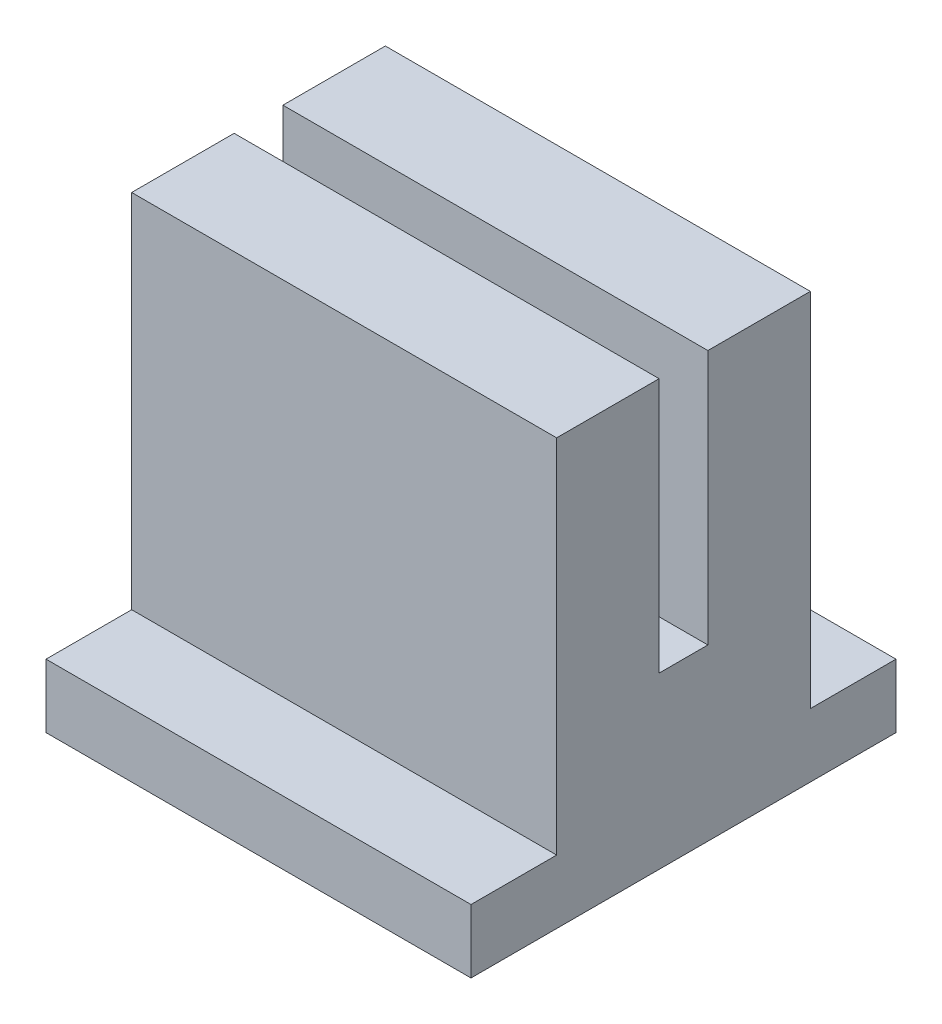
ISO-10303-21;
HEADER;
FILE_DESCRIPTION(('STEP AP214'),'2;1');
FILE_NAME('part.step','',(''),(''),'','','');
FILE_SCHEMA(('AUTOMOTIVE_DESIGN { 1 0 10303 214 1 1 1 1 }'));
ENDSEC;
DATA;
#1=APPLICATION_CONTEXT('core data for automotive mechanical design processes');
#2=APPLICATION_PROTOCOL_DEFINITION('international standard','automotive_design',2000,#1);
#3=PRODUCT_CONTEXT('',#1,'mechanical');
#4=PRODUCT('Part','Part','',(#3));
#5=PRODUCT_RELATED_PRODUCT_CATEGORY('part','',(#4));
#6=PRODUCT_DEFINITION_FORMATION('','',#4);
#7=PRODUCT_DEFINITION_CONTEXT('part definition',#1,'design');
#8=PRODUCT_DEFINITION('design','',#6,#7);
#9=PRODUCT_DEFINITION_SHAPE('','',#8);
#10=(LENGTH_UNIT() NAMED_UNIT(*) SI_UNIT(.MILLI.,.METRE.));
#11=(NAMED_UNIT(*) PLANE_ANGLE_UNIT() SI_UNIT($,.RADIAN.));
#12=(NAMED_UNIT(*) SI_UNIT($,.STERADIAN.) SOLID_ANGLE_UNIT());
#13=UNCERTAINTY_MEASURE_WITH_UNIT(LENGTH_MEASURE(1.E-05),#10,'distance_accuracy_value','');
#14=(GEOMETRIC_REPRESENTATION_CONTEXT(3) GLOBAL_UNCERTAINTY_ASSIGNED_CONTEXT((#13)) GLOBAL_UNIT_ASSIGNED_CONTEXT((#10,
#11,#12)) REPRESENTATION_CONTEXT('',''));
#15=CARTESIAN_POINT('',(0.,0.,0.));
#16=DIRECTION('',(0.,0.,1.));
#17=DIRECTION('',(1.,0.,0.));
#18=AXIS2_PLACEMENT_3D('',#15,#16,#17);
#19=CARTESIAN_POINT('',(50.,0.,-10.0763223523826));
#20=DIRECTION('',(0.,-1.,0.));
#21=DIRECTION('',(0.,0.,-1.));
#22=AXIS2_PLACEMENT_3D('',#19,#20,#21);
#23=PLANE('',#22);
#24=DIRECTION('',(0.,0.,1.));
#25=VECTOR('',#24,1.);
#26=CARTESIAN_POINT('',(0.,0.,-10.0763223523826));
#27=LINE('',#26,#25);
#28=CARTESIAN_POINT('',(0.,0.,-10.0763223523826));
#29=VERTEX_POINT('',#28);
#30=CARTESIAN_POINT('',(0.,0.,0.));
#31=VERTEX_POINT('',#30);
#32=EDGE_CURVE('E164',#29,#31,#27,.T.);
#33=ORIENTED_EDGE('',*,*,#32,.T.);
#34=DIRECTION('',(-1.,0.,0.));
#35=VECTOR('',#34,1.);
#36=CARTESIAN_POINT('',(50.,0.,0.));
#37=LINE('',#36,#35);
#38=CARTESIAN_POINT('',(50.,0.,0.));
#39=VERTEX_POINT('',#38);
#40=EDGE_CURVE('E11',#39,#31,#37,.T.);
#41=ORIENTED_EDGE('',*,*,#40,.F.);
#42=DIRECTION('',(0.,0.,1.));
#43=VECTOR('',#42,1.);
#44=CARTESIAN_POINT('',(50.,0.,-10.0763223523826));
#45=LINE('',#44,#43);
#46=CARTESIAN_POINT('',(50.,0.,-10.0763223523826));
#47=VERTEX_POINT('',#46);
#48=EDGE_CURVE('E198',#47,#39,#45,.T.);
#49=ORIENTED_EDGE('',*,*,#48,.F.);
#50=DIRECTION('',(-1.,0.,0.));
#51=VECTOR('',#50,1.);
#52=CARTESIAN_POINT('',(50.,0.,-10.0763223523826));
#53=LINE('',#52,#51);
#54=EDGE_CURVE('E160',#47,#29,#53,.T.);
#55=ORIENTED_EDGE('',*,*,#54,.T.);
#56=EDGE_LOOP('',(#33,#41,#49,#55));
#57=FACE_BOUND('',#56,.T.);
#58=ADVANCED_FACE('F39',(#57),#23,.F.);
#59=CARTESIAN_POINT('',(50.,0.,0.));
#60=DIRECTION('',(0.,0.,-1.));
#61=DIRECTION('',(-1.,0.,0.));
#62=AXIS2_PLACEMENT_3D('',#59,#60,#61);
#63=PLANE('',#62);
#64=DIRECTION('',(0.,-1.,0.));
#65=VECTOR('',#64,1.);
#66=CARTESIAN_POINT('',(0.,0.,0.));
#67=LINE('',#66,#65);
#68=CARTESIAN_POINT('',(0.,-7.48792516601166,0.));
#69=VERTEX_POINT('',#68);
#70=EDGE_CURVE('E168',#31,#69,#67,.T.);
#71=ORIENTED_EDGE('',*,*,#70,.T.);
#72=DIRECTION('',(-1.,0.,0.));
#73=VECTOR('',#72,1.);
#74=CARTESIAN_POINT('',(50.,-7.48792516601166,0.));
#75=LINE('',#74,#73);
#76=CARTESIAN_POINT('',(50.,-7.48792516601166,0.));
#77=VERTEX_POINT('',#76);
#78=EDGE_CURVE('E48',#77,#69,#75,.T.);
#79=ORIENTED_EDGE('',*,*,#78,.F.);
#80=DIRECTION('',(0.,-1.,0.));
#81=VECTOR('',#80,1.);
#82=CARTESIAN_POINT('',(50.,0.,0.));
#83=LINE('',#82,#81);
#84=EDGE_CURVE('E111',#39,#77,#83,.T.);
#85=ORIENTED_EDGE('',*,*,#84,.F.);
#86=ORIENTED_EDGE('',*,*,#40,.T.);
#87=EDGE_LOOP('',(#71,#79,#85,#86));
#88=FACE_BOUND('',#87,.T.);
#89=ADVANCED_FACE('F292',(#88),#63,.F.);
#90=CARTESIAN_POINT('',(50.,-7.48792516601166,0.));
#91=DIRECTION('',(0.,1.,0.));
#92=DIRECTION('',(0.,0.,1.));
#93=AXIS2_PLACEMENT_3D('',#90,#91,#92);
#94=PLANE('',#93);
#95=DIRECTION('',(0.,0.,-1.));
#96=VECTOR('',#95,1.);
#97=CARTESIAN_POINT('',(0.,-7.48792516601166,0.));
#98=LINE('',#97,#96);
#99=CARTESIAN_POINT('',(0.,-7.48792516601166,-50.));
#100=VERTEX_POINT('',#99);
#101=EDGE_CURVE('E171',#69,#100,#98,.T.);
#102=ORIENTED_EDGE('',*,*,#101,.T.);
#103=DIRECTION('',(-1.,0.,0.));
#104=VECTOR('',#103,1.);
#105=CARTESIAN_POINT('',(50.,-7.48792516601166,-50.));
#106=LINE('',#105,#104);
#107=CARTESIAN_POINT('',(50.,-7.48792516601166,-50.));
#108=VERTEX_POINT('',#107);
#109=EDGE_CURVE('E225',#108,#100,#106,.T.);
#110=ORIENTED_EDGE('',*,*,#109,.F.);
#111=DIRECTION('',(0.,0.,-1.));
#112=VECTOR('',#111,1.);
#113=CARTESIAN_POINT('',(50.,-7.48792516601166,0.));
#114=LINE('',#113,#112);
#115=EDGE_CURVE('E235',#77,#108,#114,.T.);
#116=ORIENTED_EDGE('',*,*,#115,.F.);
#117=ORIENTED_EDGE('',*,*,#78,.T.);
#118=EDGE_LOOP('',(#102,#110,#116,#117));
#119=FACE_BOUND('',#118,.T.);
#120=ADVANCED_FACE('F233',(#119),#94,.F.);
#121=CARTESIAN_POINT('',(50.,-7.48792516601166,-50.));
#122=DIRECTION('',(0.,0.,1.));
#123=DIRECTION('',(1.,0.,0.));
#124=AXIS2_PLACEMENT_3D('',#121,#122,#123);
#125=PLANE('',#124);
#126=DIRECTION('',(0.,1.,0.));
#127=VECTOR('',#126,1.);
#128=CARTESIAN_POINT('',(0.,-7.48792516601166,-50.));
#129=LINE('',#128,#127);
#130=CARTESIAN_POINT('',(0.,0.,-50.));
#131=VERTEX_POINT('',#130);
#132=EDGE_CURVE('E174',#100,#131,#129,.T.);
#133=ORIENTED_EDGE('',*,*,#132,.T.);
#134=DIRECTION('',(-1.,0.,0.));
#135=VECTOR('',#134,1.);
#136=CARTESIAN_POINT('',(50.,0.,-50.));
#137=LINE('',#136,#135);
#138=CARTESIAN_POINT('',(50.,0.,-50.));
#139=VERTEX_POINT('',#138);
#140=EDGE_CURVE('E221',#139,#131,#137,.T.);
#141=ORIENTED_EDGE('',*,*,#140,.F.);
#142=DIRECTION('',(0.,1.,0.));
#143=VECTOR('',#142,1.);
#144=CARTESIAN_POINT('',(50.,-7.48792516601166,-50.));
#145=LINE('',#144,#143);
#146=EDGE_CURVE('E254',#108,#139,#145,.T.);
#147=ORIENTED_EDGE('',*,*,#146,.F.);
#148=ORIENTED_EDGE('',*,*,#109,.T.);
#149=EDGE_LOOP('',(#133,#141,#147,#148));
#150=FACE_BOUND('',#149,.T.);
#151=ADVANCED_FACE('F244',(#150),#125,.F.);
#152=CARTESIAN_POINT('',(50.,0.,-50.));
#153=DIRECTION('',(0.,-1.,0.));
#154=DIRECTION('',(0.,0.,-1.));
#155=AXIS2_PLACEMENT_3D('',#152,#153,#154);
#156=PLANE('',#155);
#157=DIRECTION('',(0.,0.,1.));
#158=VECTOR('',#157,1.);
#159=CARTESIAN_POINT('',(0.,0.,-50.));
#160=LINE('',#159,#158);
#161=CARTESIAN_POINT('',(0.,0.,-39.9236776476174));
#162=VERTEX_POINT('',#161);
#163=EDGE_CURVE('E177',#131,#162,#160,.T.);
#164=ORIENTED_EDGE('',*,*,#163,.T.);
#165=DIRECTION('',(-1.,0.,0.));
#166=VECTOR('',#165,1.);
#167=CARTESIAN_POINT('',(50.,0.,-39.9236776476174));
#168=LINE('',#167,#166);
#169=CARTESIAN_POINT('',(50.,0.,-39.9236776476174));
#170=VERTEX_POINT('',#169);
#171=EDGE_CURVE('E217',#170,#162,#168,.T.);
#172=ORIENTED_EDGE('',*,*,#171,.F.);
#173=DIRECTION('',(0.,0.,1.));
#174=VECTOR('',#173,1.);
#175=CARTESIAN_POINT('',(50.,0.,-50.));
#176=LINE('',#175,#174);
#177=EDGE_CURVE('E250',#139,#170,#176,.T.);
#178=ORIENTED_EDGE('',*,*,#177,.F.);
#179=ORIENTED_EDGE('',*,*,#140,.T.);
#180=EDGE_LOOP('',(#164,#172,#178,#179));
#181=FACE_BOUND('',#180,.T.);
#182=ADVANCED_FACE('F248',(#181),#156,.F.);
#183=CARTESIAN_POINT('',(50.,0.,-39.9236776476174));
#184=DIRECTION('',(0.,0.,1.));
#185=DIRECTION('',(1.,0.,0.));
#186=AXIS2_PLACEMENT_3D('',#183,#184,#185);
#187=PLANE('',#186);
#188=DIRECTION('',(0.,1.,0.));
#189=VECTOR('',#188,1.);
#190=CARTESIAN_POINT('',(0.,0.,-39.9236776476174));
#191=LINE('',#190,#189);
#192=CARTESIAN_POINT('',(0.,42.5120748339884,-39.9236776476174));
#193=VERTEX_POINT('',#192);
#194=EDGE_CURVE('E180',#162,#193,#191,.T.);
#195=ORIENTED_EDGE('',*,*,#194,.T.);
#196=DIRECTION('',(-1.,0.,0.));
#197=VECTOR('',#196,1.);
#198=CARTESIAN_POINT('',(50.,42.5120748339884,-39.9236776476174));
#199=LINE('',#198,#197);
#200=CARTESIAN_POINT('',(50.,42.5120748339884,-39.9236776476174));
#201=VERTEX_POINT('',#200);
#202=EDGE_CURVE('E213',#201,#193,#199,.T.);
#203=ORIENTED_EDGE('',*,*,#202,.F.);
#204=DIRECTION('',(0.,1.,0.));
#205=VECTOR('',#204,1.);
#206=CARTESIAN_POINT('',(50.,0.,-39.9236776476174));
#207=LINE('',#206,#205);
#208=EDGE_CURVE('E253',#170,#201,#207,.T.);
#209=ORIENTED_EDGE('',*,*,#208,.F.);
#210=ORIENTED_EDGE('',*,*,#171,.T.);
#211=EDGE_LOOP('',(#195,#203,#209,#210));
#212=FACE_BOUND('',#211,.T.);
#213=ADVANCED_FACE('F305',(#212),#187,.F.);
#214=CARTESIAN_POINT('',(50.,42.5120748339884,-39.9236776476174));
#215=DIRECTION('',(0.,-1.,0.));
#216=DIRECTION('',(0.,0.,-1.));
#217=AXIS2_PLACEMENT_3D('',#214,#215,#216);
#218=PLANE('',#217);
#219=DIRECTION('',(0.,0.,1.));
#220=VECTOR('',#219,1.);
#221=CARTESIAN_POINT('',(0.,42.5120748339884,-39.9236776476174));
#222=LINE('',#221,#220);
#223=CARTESIAN_POINT('',(0.,42.5120748339884,-27.8683473652968));
#224=VERTEX_POINT('',#223);
#225=EDGE_CURVE('E183',#193,#224,#222,.T.);
#226=ORIENTED_EDGE('',*,*,#225,.T.);
#227=DIRECTION('',(-1.,0.,0.));
#228=VECTOR('',#227,1.);
#229=CARTESIAN_POINT('',(50.,42.5120748339884,-27.8683473652968));
#230=LINE('',#229,#228);
#231=CARTESIAN_POINT('',(50.,42.5120748339884,-27.8683473652968));
#232=VERTEX_POINT('',#231);
#233=EDGE_CURVE('E209',#232,#224,#230,.T.);
#234=ORIENTED_EDGE('',*,*,#233,.F.);
#235=DIRECTION('',(0.,0.,1.));
#236=VECTOR('',#235,1.);
#237=CARTESIAN_POINT('',(50.,42.5120748339884,-39.9236776476174));
#238=LINE('',#237,#236);
#239=EDGE_CURVE('E258',#201,#232,#238,.T.);
#240=ORIENTED_EDGE('',*,*,#239,.F.);
#241=ORIENTED_EDGE('',*,*,#202,.T.);
#242=EDGE_LOOP('',(#226,#234,#240,#241));
#243=FACE_BOUND('',#242,.T.);
#244=ADVANCED_FACE('F308',(#243),#218,.F.);
#245=CARTESIAN_POINT('',(50.,42.5120748339884,-27.8683473652968));
#246=DIRECTION('',(0.,0.,-1.));
#247=DIRECTION('',(-1.,0.,0.));
#248=AXIS2_PLACEMENT_3D('',#245,#246,#247);
#249=PLANE('',#248);
#250=DIRECTION('',(0.,-1.,0.));
#251=VECTOR('',#250,1.);
#252=CARTESIAN_POINT('',(0.,42.5120748339884,-27.8683473652968));
#253=LINE('',#252,#251);
#254=CARTESIAN_POINT('',(0.,12.5120748339883,-27.8683473652968));
#255=VERTEX_POINT('',#254);
#256=EDGE_CURVE('E186',#224,#255,#253,.T.);
#257=ORIENTED_EDGE('',*,*,#256,.T.);
#258=DIRECTION('',(-1.,0.,0.));
#259=VECTOR('',#258,1.);
#260=CARTESIAN_POINT('',(50.,12.5120748339883,-27.8683473652968));
#261=LINE('',#260,#259);
#262=CARTESIAN_POINT('',(50.,12.5120748339883,-27.8683473652968));
#263=VERTEX_POINT('',#262);
#264=EDGE_CURVE('E205',#263,#255,#261,.T.);
#265=ORIENTED_EDGE('',*,*,#264,.F.);
#266=DIRECTION('',(0.,-1.,0.));
#267=VECTOR('',#266,1.);
#268=CARTESIAN_POINT('',(50.,42.5120748339884,-27.8683473652968));
#269=LINE('',#268,#267);
#270=EDGE_CURVE('E265',#232,#263,#269,.T.);
#271=ORIENTED_EDGE('',*,*,#270,.F.);
#272=ORIENTED_EDGE('',*,*,#233,.T.);
#273=EDGE_LOOP('',(#257,#265,#271,#272));
#274=FACE_BOUND('',#273,.T.);
#275=ADVANCED_FACE('F273',(#274),#249,.F.);
#276=CARTESIAN_POINT('',(50.,12.5120748339883,-27.8683473652968));
#277=DIRECTION('',(0.,-1.,0.));
#278=DIRECTION('',(0.,0.,-1.));
#279=AXIS2_PLACEMENT_3D('',#276,#277,#278);
#280=PLANE('',#279);
#281=DIRECTION('',(0.,0.,1.));
#282=VECTOR('',#281,1.);
#283=CARTESIAN_POINT('',(0.,12.5120748339883,-27.8683473652968));
#284=LINE('',#283,#282);
#285=CARTESIAN_POINT('',(0.,12.5120748339883,-22.1316526347032));
#286=VERTEX_POINT('',#285);
#287=EDGE_CURVE('E189',#255,#286,#284,.T.);
#288=ORIENTED_EDGE('',*,*,#287,.T.);
#289=DIRECTION('',(-1.,0.,0.));
#290=VECTOR('',#289,1.);
#291=CARTESIAN_POINT('',(50.,12.5120748339883,-22.1316526347032));
#292=LINE('',#291,#290);
#293=CARTESIAN_POINT('',(50.,12.5120748339883,-22.1316526347032));
#294=VERTEX_POINT('',#293);
#295=EDGE_CURVE('E153',#294,#286,#292,.T.);
#296=ORIENTED_EDGE('',*,*,#295,.F.);
#297=DIRECTION('',(0.,0.,1.));
#298=VECTOR('',#297,1.);
#299=CARTESIAN_POINT('',(50.,12.5120748339883,-27.8683473652968));
#300=LINE('',#299,#298);
#301=EDGE_CURVE('E142',#263,#294,#300,.T.);
#302=ORIENTED_EDGE('',*,*,#301,.F.);
#303=ORIENTED_EDGE('',*,*,#264,.T.);
#304=EDGE_LOOP('',(#288,#296,#302,#303));
#305=FACE_BOUND('',#304,.T.);
#306=ADVANCED_FACE('F277',(#305),#280,.F.);
#307=CARTESIAN_POINT('',(50.,12.5120748339883,-22.1316526347032));
#308=DIRECTION('',(0.,0.,1.));
#309=DIRECTION('',(1.,0.,0.));
#310=AXIS2_PLACEMENT_3D('',#307,#308,#309);
#311=PLANE('',#310);
#312=DIRECTION('',(0.,1.,0.));
#313=VECTOR('',#312,1.);
#314=CARTESIAN_POINT('',(0.,12.5120748339883,-22.1316526347032));
#315=LINE('',#314,#313);
#316=CARTESIAN_POINT('',(0.,42.5120748339883,-22.1316526347032));
#317=VERTEX_POINT('',#316);
#318=EDGE_CURVE('E151',#286,#317,#315,.T.);
#319=ORIENTED_EDGE('',*,*,#318,.T.);
#320=DIRECTION('',(-1.,0.,0.));
#321=VECTOR('',#320,1.);
#322=CARTESIAN_POINT('',(50.,42.5120748339883,-22.1316526347032));
#323=LINE('',#322,#321);
#324=CARTESIAN_POINT('',(50.,42.5120748339883,-22.1316526347032));
#325=VERTEX_POINT('',#324);
#326=EDGE_CURVE('E148',#325,#317,#323,.T.);
#327=ORIENTED_EDGE('',*,*,#326,.F.);
#328=DIRECTION('',(0.,1.,0.));
#329=VECTOR('',#328,1.);
#330=CARTESIAN_POINT('',(50.,12.5120748339883,-22.1316526347032));
#331=LINE('',#330,#329);
#332=EDGE_CURVE('E136',#294,#325,#331,.T.);
#333=ORIENTED_EDGE('',*,*,#332,.F.);
#334=ORIENTED_EDGE('',*,*,#295,.T.);
#335=EDGE_LOOP('',(#319,#327,#333,#334));
#336=FACE_BOUND('',#335,.T.);
#337=ADVANCED_FACE('F149',(#336),#311,.F.);
#338=CARTESIAN_POINT('',(50.,42.5120748339883,-22.1316526347032));
#339=DIRECTION('',(0.,-1.,0.));
#340=DIRECTION('',(0.,0.,-1.));
#341=AXIS2_PLACEMENT_3D('',#338,#339,#340);
#342=PLANE('',#341);
#343=DIRECTION('',(0.,0.,1.));
#344=VECTOR('',#343,1.);
#345=CARTESIAN_POINT('',(0.,42.5120748339883,-22.1316526347032));
#346=LINE('',#345,#344);
#347=CARTESIAN_POINT('',(0.,42.5120748339883,-10.0763223523826));
#348=VERTEX_POINT('',#347);
#349=EDGE_CURVE('E97',#317,#348,#346,.T.);
#350=ORIENTED_EDGE('',*,*,#349,.T.);
#351=DIRECTION('',(-1.,0.,0.));
#352=VECTOR('',#351,1.);
#353=CARTESIAN_POINT('',(50.,42.5120748339883,-10.0763223523826));
#354=LINE('',#353,#352);
#355=CARTESIAN_POINT('',(50.,42.5120748339883,-10.0763223523826));
#356=VERTEX_POINT('',#355);
#357=EDGE_CURVE('E154',#356,#348,#354,.T.);
#358=ORIENTED_EDGE('',*,*,#357,.F.);
#359=DIRECTION('',(0.,0.,1.));
#360=VECTOR('',#359,1.);
#361=CARTESIAN_POINT('',(50.,42.5120748339883,-22.1316526347032));
#362=LINE('',#361,#360);
#363=EDGE_CURVE('E140',#325,#356,#362,.T.);
#364=ORIENTED_EDGE('',*,*,#363,.F.);
#365=ORIENTED_EDGE('',*,*,#326,.T.);
#366=EDGE_LOOP('',(#350,#358,#364,#365));
#367=FACE_BOUND('',#366,.T.);
#368=ADVANCED_FACE('F156',(#367),#342,.F.);
#369=CARTESIAN_POINT('',(50.,42.5120748339883,-10.0763223523826));
#370=DIRECTION('',(0.,0.,-1.));
#371=DIRECTION('',(0.,1.,0.));
#372=AXIS2_PLACEMENT_3D('',#369,#370,#371);
#373=PLANE('',#372);
#374=DIRECTION('',(0.,-1.,0.));
#375=VECTOR('',#374,1.);
#376=CARTESIAN_POINT('',(0.,42.5120748339883,-10.0763223523826));
#377=LINE('',#376,#375);
#378=EDGE_CURVE('E103',#348,#29,#377,.T.);
#379=ORIENTED_EDGE('',*,*,#378,.T.);
#380=ORIENTED_EDGE('',*,*,#54,.F.);
#381=DIRECTION('',(0.,-1.,0.));
#382=VECTOR('',#381,1.);
#383=CARTESIAN_POINT('',(50.,42.5120748339883,-10.0763223523826));
#384=LINE('',#383,#382);
#385=EDGE_CURVE('E56',#356,#47,#384,.T.);
#386=ORIENTED_EDGE('',*,*,#385,.F.);
#387=ORIENTED_EDGE('',*,*,#357,.T.);
#388=EDGE_LOOP('',(#379,#380,#386,#387));
#389=FACE_BOUND('',#388,.T.);
#390=ADVANCED_FACE('F281',(#389),#373,.F.);
#391=CARTESIAN_POINT('',(50.,0.,0.));
#392=DIRECTION('',(1.,0.,0.));
#393=DIRECTION('',(0.,0.,-1.));
#394=AXIS2_PLACEMENT_3D('',#391,#392,#393);
#395=PLANE('',#394);
#396=ORIENTED_EDGE('',*,*,#48,.T.);
#397=ORIENTED_EDGE('',*,*,#84,.T.);
#398=ORIENTED_EDGE('',*,*,#115,.T.);
#399=ORIENTED_EDGE('',*,*,#146,.T.);
#400=ORIENTED_EDGE('',*,*,#177,.T.);
#401=ORIENTED_EDGE('',*,*,#208,.T.);
#402=ORIENTED_EDGE('',*,*,#239,.T.);
#403=ORIENTED_EDGE('',*,*,#270,.T.);
#404=ORIENTED_EDGE('',*,*,#301,.T.);
#405=ORIENTED_EDGE('',*,*,#332,.T.);
#406=ORIENTED_EDGE('',*,*,#363,.T.);
#407=ORIENTED_EDGE('',*,*,#385,.T.);
#408=EDGE_LOOP('',(#396,#397,#398,#399,#400,#401,#402,#403,#404,#405,#406,#407));
#409=FACE_BOUND('',#408,.T.);
#410=ADVANCED_FACE('F138',(#409),#395,.T.);
#411=CARTESIAN_POINT('',(0.,0.,0.));
#412=DIRECTION('',(1.,0.,0.));
#413=DIRECTION('',(0.,0.,-1.));
#414=AXIS2_PLACEMENT_3D('',#411,#412,#413);
#415=PLANE('',#414);
#416=ORIENTED_EDGE('',*,*,#32,.F.);
#417=ORIENTED_EDGE('',*,*,#378,.F.);
#418=ORIENTED_EDGE('',*,*,#349,.F.);
#419=ORIENTED_EDGE('',*,*,#318,.F.);
#420=ORIENTED_EDGE('',*,*,#287,.F.);
#421=ORIENTED_EDGE('',*,*,#256,.F.);
#422=ORIENTED_EDGE('',*,*,#225,.F.);
#423=ORIENTED_EDGE('',*,*,#194,.F.);
#424=ORIENTED_EDGE('',*,*,#163,.F.);
#425=ORIENTED_EDGE('',*,*,#132,.F.);
#426=ORIENTED_EDGE('',*,*,#101,.F.);
#427=ORIENTED_EDGE('',*,*,#70,.F.);
#428=EDGE_LOOP('',(#416,#417,#418,#419,#420,#421,#422,#423,#424,#425,#426,#427));
#429=FACE_BOUND('',#428,.T.);
#430=ADVANCED_FACE('F239',(#429),#415,.F.);
#431=CLOSED_SHELL('',(#58,#89,#120,#151,#182,#213,#244,#275,#306,#337,#368,#390,#410,#430));
#432=MANIFOLD_SOLID_BREP('B2',#431);
#433=ADVANCED_BREP_SHAPE_REPRESENTATION('',(#18,#432),#14);
#434=SHAPE_DEFINITION_REPRESENTATION(#9,#433);
ENDSEC;
END-ISO-10303-21;
